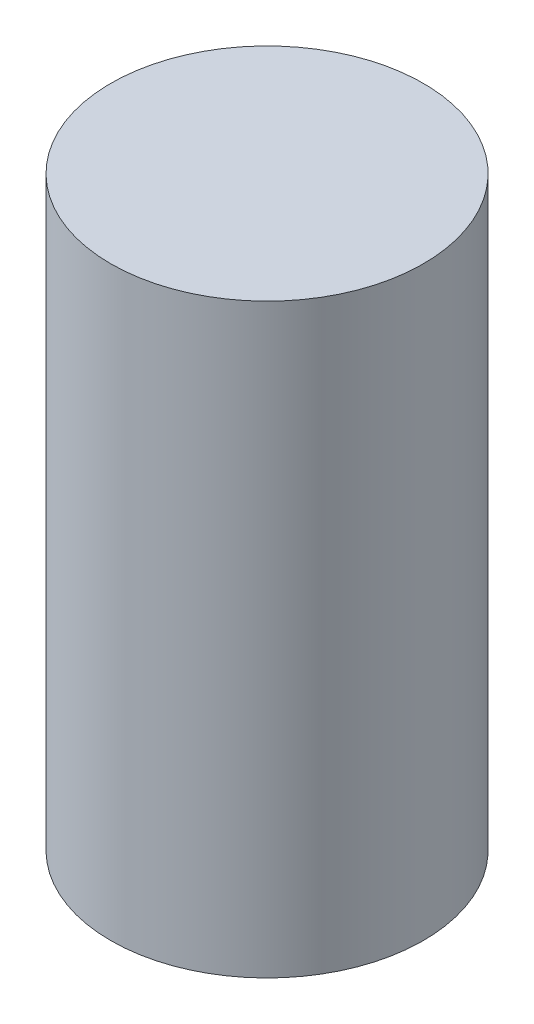
ISO-10303-21;
HEADER;
FILE_DESCRIPTION(('STEP AP214'),'2;1');
FILE_NAME('part.step','',(''),(''),'','','');
FILE_SCHEMA(('AUTOMOTIVE_DESIGN { 1 0 10303 214 1 1 1 1 }'));
ENDSEC;
DATA;
#1=APPLICATION_CONTEXT('core data for automotive mechanical design processes');
#2=APPLICATION_PROTOCOL_DEFINITION('international standard','automotive_design',2000,#1);
#3=PRODUCT_CONTEXT('',#1,'mechanical');
#4=PRODUCT('Part','Part','',(#3));
#5=PRODUCT_RELATED_PRODUCT_CATEGORY('part','',(#4));
#6=PRODUCT_DEFINITION_FORMATION('','',#4);
#7=PRODUCT_DEFINITION_CONTEXT('part definition',#1,'design');
#8=PRODUCT_DEFINITION('design','',#6,#7);
#9=PRODUCT_DEFINITION_SHAPE('','',#8);
#10=(LENGTH_UNIT() NAMED_UNIT(*) SI_UNIT(.MILLI.,.METRE.));
#11=(NAMED_UNIT(*) PLANE_ANGLE_UNIT() SI_UNIT($,.RADIAN.));
#12=(NAMED_UNIT(*) SI_UNIT($,.STERADIAN.) SOLID_ANGLE_UNIT());
#13=UNCERTAINTY_MEASURE_WITH_UNIT(LENGTH_MEASURE(1.E-05),#10,'distance_accuracy_value','');
#14=(GEOMETRIC_REPRESENTATION_CONTEXT(3) GLOBAL_UNCERTAINTY_ASSIGNED_CONTEXT((#13)) GLOBAL_UNIT_ASSIGNED_CONTEXT((#10,
#11,#12)) REPRESENTATION_CONTEXT('',''));
#15=CARTESIAN_POINT('',(0.,0.,0.));
#16=DIRECTION('',(0.,0.,1.));
#17=DIRECTION('',(1.,0.,0.));
#18=AXIS2_PLACEMENT_3D('',#15,#16,#17);
#19=CARTESIAN_POINT('',(0.,15.,0.));
#20=DIRECTION('',(0.,-1.,0.));
#21=DIRECTION('',(0.,0.,-1.));
#22=AXIS2_PLACEMENT_3D('',#19,#20,#21);
#23=CYLINDRICAL_SURFACE('',#22,4.);
#24=CARTESIAN_POINT('',(0.,15.,0.));
#25=DIRECTION('',(0.,1.,0.));
#26=DIRECTION('',(0.,0.,1.));
#27=AXIS2_PLACEMENT_3D('',#24,#25,#26);
#28=CIRCLE('',#27,4.);
#29=CARTESIAN_POINT('',(0.,15.,4.));
#30=VERTEX_POINT('',#29);
#31=EDGE_CURVE('E10',#30,#30,#28,.T.);
#32=ORIENTED_EDGE('',*,*,#31,.F.);
#33=EDGE_LOOP('',(#32));
#34=FACE_BOUND('',#33,.T.);
#35=CARTESIAN_POINT('',(0.,0.,0.));
#36=DIRECTION('',(0.,1.,0.));
#37=DIRECTION('',(0.,0.,1.));
#38=AXIS2_PLACEMENT_3D('',#35,#36,#37);
#39=CIRCLE('',#38,4.);
#40=CARTESIAN_POINT('',(0.,0.,4.));
#41=VERTEX_POINT('',#40);
#42=EDGE_CURVE('E34',#41,#41,#39,.T.);
#43=ORIENTED_EDGE('',*,*,#42,.T.);
#44=EDGE_LOOP('',(#43));
#45=FACE_BOUND('',#44,.T.);
#46=ADVANCED_FACE('F31',(#34,#45),#23,.T.);
#47=CARTESIAN_POINT('',(0.,15.,0.));
#48=DIRECTION('',(0.,1.,0.));
#49=DIRECTION('',(0.,0.,1.));
#50=AXIS2_PLACEMENT_3D('',#47,#48,#49);
#51=PLANE('',#50);
#52=ORIENTED_EDGE('',*,*,#31,.T.);
#53=EDGE_LOOP('',(#52));
#54=FACE_BOUND('',#53,.T.);
#55=ADVANCED_FACE('F46',(#54),#51,.T.);
#56=CARTESIAN_POINT('',(0.,0.,0.));
#57=DIRECTION('',(0.,1.,0.));
#58=DIRECTION('',(0.,0.,1.));
#59=AXIS2_PLACEMENT_3D('',#56,#57,#58);
#60=PLANE('',#59);
#61=ORIENTED_EDGE('',*,*,#42,.F.);
#62=EDGE_LOOP('',(#61));
#63=FACE_BOUND('',#62,.T.);
#64=ADVANCED_FACE('F44',(#63),#60,.F.);
#65=CLOSED_SHELL('',(#46,#55,#64));
#66=MANIFOLD_SOLID_BREP('B2',#65);
#67=ADVANCED_BREP_SHAPE_REPRESENTATION('',(#18,#66),#14);
#68=SHAPE_DEFINITION_REPRESENTATION(#9,#67);
ENDSEC;
END-ISO-10303-21;
